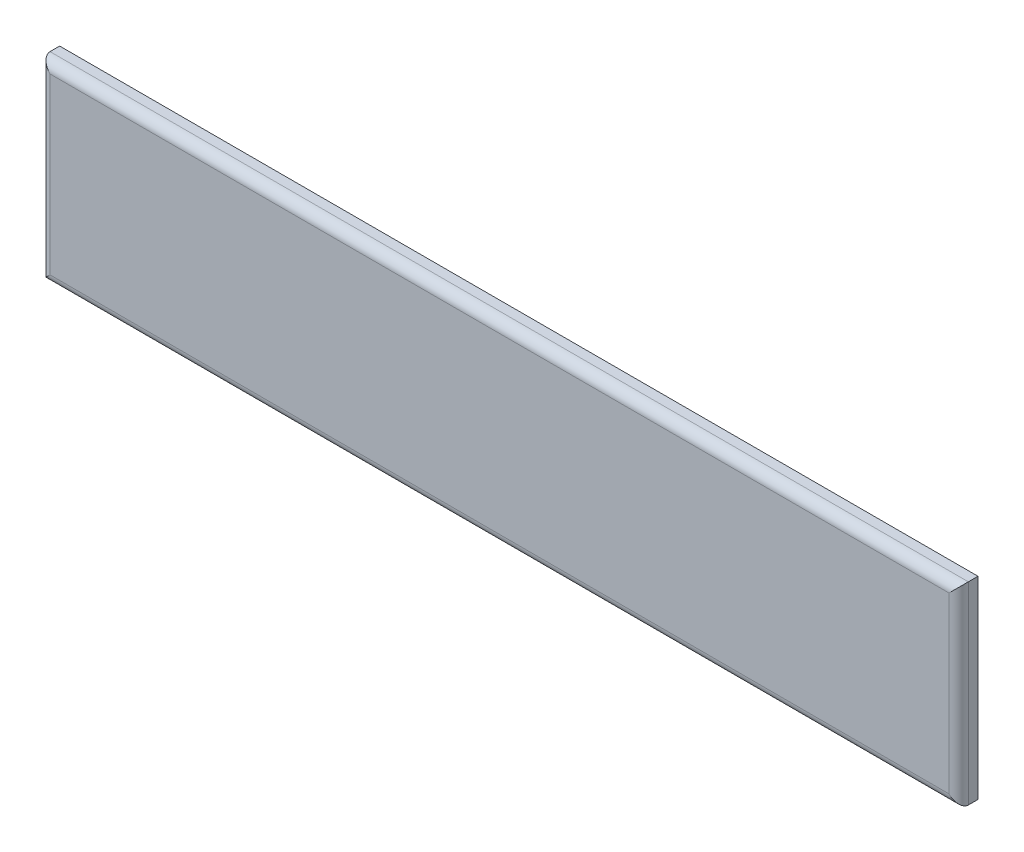
ISO-10303-21;
HEADER;
FILE_DESCRIPTION(('STEP AP214'),'2;1');
FILE_NAME('part.step','',(''),(''),'','','');
FILE_SCHEMA(('AUTOMOTIVE_DESIGN { 1 0 10303 214 1 1 1 1 }'));
ENDSEC;
DATA;
#1=APPLICATION_CONTEXT('core data for automotive mechanical design processes');
#2=APPLICATION_PROTOCOL_DEFINITION('international standard','automotive_design',2000,#1);
#3=PRODUCT_CONTEXT('',#1,'mechanical');
#4=PRODUCT('Part','Part','',(#3));
#5=PRODUCT_RELATED_PRODUCT_CATEGORY('part','',(#4));
#6=PRODUCT_DEFINITION_FORMATION('','',#4);
#7=PRODUCT_DEFINITION_CONTEXT('part definition',#1,'design');
#8=PRODUCT_DEFINITION('design','',#6,#7);
#9=PRODUCT_DEFINITION_SHAPE('','',#8);
#10=(LENGTH_UNIT() NAMED_UNIT(*) SI_UNIT(.MILLI.,.METRE.));
#11=(NAMED_UNIT(*) PLANE_ANGLE_UNIT() SI_UNIT($,.RADIAN.));
#12=(NAMED_UNIT(*) SI_UNIT($,.STERADIAN.) SOLID_ANGLE_UNIT());
#13=UNCERTAINTY_MEASURE_WITH_UNIT(LENGTH_MEASURE(1.E-05),#10,'distance_accuracy_value','');
#14=(GEOMETRIC_REPRESENTATION_CONTEXT(3) GLOBAL_UNCERTAINTY_ASSIGNED_CONTEXT((#13)) GLOBAL_UNIT_ASSIGNED_CONTEXT((#10,
#11,#12)) REPRESENTATION_CONTEXT('',''));
#15=CARTESIAN_POINT('',(0.,0.,0.));
#16=DIRECTION('',(0.,0.,1.));
#17=DIRECTION('',(1.,0.,0.));
#18=AXIS2_PLACEMENT_3D('',#15,#16,#17);
#19=CARTESIAN_POINT('',(-47.5,-10.,1.));
#20=DIRECTION('',(1.,0.,0.));
#21=DIRECTION('',(0.,0.,-1.));
#22=AXIS2_PLACEMENT_3D('',#19,#20,#21);
#23=PLANE('',#22);
#24=DIRECTION('',(0.,0.,-1.));
#25=VECTOR('',#24,1.);
#26=CARTESIAN_POINT('',(-47.5,-10.,1.));
#27=LINE('',#26,#25);
#28=CARTESIAN_POINT('',(-47.5,-10.,0.));
#29=VERTEX_POINT('',#28);
#30=CARTESIAN_POINT('',(-47.5,-10.,-1.));
#31=VERTEX_POINT('',#30);
#32=EDGE_CURVE('E264',#29,#31,#27,.T.);
#33=ORIENTED_EDGE('',*,*,#32,.F.);
#34=DIRECTION('',(0.,-1.,0.));
#35=VECTOR('',#34,1.);
#36=CARTESIAN_POINT('',(-47.5,9.99999999999999,0.));
#37=LINE('',#36,#35);
#38=CARTESIAN_POINT('',(-47.5,9.99999999999999,0.));
#39=VERTEX_POINT('',#38);
#40=EDGE_CURVE('E280',#29,#39,#37,.F.);
#41=ORIENTED_EDGE('',*,*,#40,.T.);
#42=DIRECTION('',(0.,0.,-1.));
#43=VECTOR('',#42,1.);
#44=CARTESIAN_POINT('',(-47.5,9.99999999999999,1.));
#45=LINE('',#44,#43);
#46=CARTESIAN_POINT('',(-47.5,9.99999999999999,-1.));
#47=VERTEX_POINT('',#46);
#48=EDGE_CURVE('E255',#39,#47,#45,.T.);
#49=ORIENTED_EDGE('',*,*,#48,.T.);
#50=DIRECTION('',(0.,-1.,0.));
#51=VECTOR('',#50,1.);
#52=CARTESIAN_POINT('',(-47.5,-10.,-1.));
#53=LINE('',#52,#51);
#54=EDGE_CURVE('E239',#47,#31,#53,.T.);
#55=ORIENTED_EDGE('',*,*,#54,.T.);
#56=EDGE_LOOP('',(#33,#41,#49,#55));
#57=FACE_BOUND('',#56,.T.);
#58=ADVANCED_FACE('F45',(#57),#23,.F.);
#59=CARTESIAN_POINT('',(47.5,-10.,1.));
#60=DIRECTION('',(0.,1.,0.));
#61=DIRECTION('',(-1.,0.,0.));
#62=AXIS2_PLACEMENT_3D('',#59,#60,#61);
#63=PLANE('',#62);
#64=DIRECTION('',(0.,0.,-1.));
#65=VECTOR('',#64,1.);
#66=CARTESIAN_POINT('',(47.5,-10.,1.));
#67=LINE('',#66,#65);
#68=CARTESIAN_POINT('',(47.5,-10.,0.));
#69=VERTEX_POINT('',#68);
#70=CARTESIAN_POINT('',(47.5,-10.,-1.));
#71=VERTEX_POINT('',#70);
#72=EDGE_CURVE('E261',#69,#71,#67,.T.);
#73=ORIENTED_EDGE('',*,*,#72,.F.);
#74=DIRECTION('',(1.,0.,0.));
#75=VECTOR('',#74,1.);
#76=CARTESIAN_POINT('',(-47.5,-10.,0.));
#77=LINE('',#76,#75);
#78=EDGE_CURVE('E284',#69,#29,#77,.F.);
#79=ORIENTED_EDGE('',*,*,#78,.T.);
#80=ORIENTED_EDGE('',*,*,#32,.T.);
#81=DIRECTION('',(1.,0.,0.));
#82=VECTOR('',#81,1.);
#83=CARTESIAN_POINT('',(47.5,-10.,-1.));
#84=LINE('',#83,#82);
#85=EDGE_CURVE('E243',#31,#71,#84,.T.);
#86=ORIENTED_EDGE('',*,*,#85,.T.);
#87=EDGE_LOOP('',(#73,#79,#80,#86));
#88=FACE_BOUND('',#87,.T.);
#89=ADVANCED_FACE('F313',(#88),#63,.F.);
#90=CARTESIAN_POINT('',(47.5,-10.,1.));
#91=DIRECTION('',(-1.,0.,0.));
#92=DIRECTION('',(0.,0.,1.));
#93=AXIS2_PLACEMENT_3D('',#90,#91,#92);
#94=PLANE('',#93);
#95=DIRECTION('',(0.,0.,-1.));
#96=VECTOR('',#95,1.);
#97=CARTESIAN_POINT('',(47.5,10.,1.));
#98=LINE('',#97,#96);
#99=CARTESIAN_POINT('',(47.5,10.,0.));
#100=VERTEX_POINT('',#99);
#101=CARTESIAN_POINT('',(47.5,10.,-1.));
#102=VERTEX_POINT('',#101);
#103=EDGE_CURVE('E258',#100,#102,#98,.T.);
#104=ORIENTED_EDGE('',*,*,#103,.F.);
#105=DIRECTION('',(0.,1.,0.));
#106=VECTOR('',#105,1.);
#107=CARTESIAN_POINT('',(47.5,-10.,0.));
#108=LINE('',#107,#106);
#109=EDGE_CURVE('E55',#100,#69,#108,.F.);
#110=ORIENTED_EDGE('',*,*,#109,.T.);
#111=ORIENTED_EDGE('',*,*,#72,.T.);
#112=DIRECTION('',(0.,1.,0.));
#113=VECTOR('',#112,1.);
#114=CARTESIAN_POINT('',(47.5,-10.,-1.));
#115=LINE('',#114,#113);
#116=EDGE_CURVE('E247',#71,#102,#115,.T.);
#117=ORIENTED_EDGE('',*,*,#116,.T.);
#118=EDGE_LOOP('',(#104,#110,#111,#117));
#119=FACE_BOUND('',#118,.T.);
#120=ADVANCED_FACE('F334',(#119),#94,.F.);
#121=CARTESIAN_POINT('',(47.5,10.,1.));
#122=DIRECTION('',(0.,-1.,0.));
#123=DIRECTION('',(1.,0.,0.));
#124=AXIS2_PLACEMENT_3D('',#121,#122,#123);
#125=PLANE('',#124);
#126=ORIENTED_EDGE('',*,*,#48,.F.);
#127=DIRECTION('',(-1.,0.,0.));
#128=VECTOR('',#127,1.);
#129=CARTESIAN_POINT('',(47.5,10.,0.));
#130=LINE('',#129,#128);
#131=EDGE_CURVE('E11',#39,#100,#130,.F.);
#132=ORIENTED_EDGE('',*,*,#131,.T.);
#133=ORIENTED_EDGE('',*,*,#103,.T.);
#134=DIRECTION('',(-1.,0.,0.));
#135=VECTOR('',#134,1.);
#136=CARTESIAN_POINT('',(47.5,10.,-1.));
#137=LINE('',#136,#135);
#138=EDGE_CURVE('E251',#102,#47,#137,.T.);
#139=ORIENTED_EDGE('',*,*,#138,.T.);
#140=EDGE_LOOP('',(#126,#132,#133,#139));
#141=FACE_BOUND('',#140,.T.);
#142=ADVANCED_FACE('F325',(#141),#125,.F.);
#143=CARTESIAN_POINT('',(0.,0.,1.));
#144=DIRECTION('',(0.,0.,1.));
#145=DIRECTION('',(1.,0.,0.));
#146=AXIS2_PLACEMENT_3D('',#143,#144,#145);
#147=PLANE('',#146);
#148=DIRECTION('',(-1.,0.,0.));
#149=VECTOR('',#148,1.);
#150=CARTESIAN_POINT('',(-47.5,8.99999999999999,1.));
#151=LINE('',#150,#149);
#152=CARTESIAN_POINT('',(46.5,9.00000000000001,1.));
#153=VERTEX_POINT('',#152);
#154=CARTESIAN_POINT('',(-46.5,8.99999999999999,1.));
#155=VERTEX_POINT('',#154);
#156=EDGE_CURVE('E267',#153,#155,#151,.T.);
#157=ORIENTED_EDGE('',*,*,#156,.T.);
#158=DIRECTION('',(0.,-1.,0.));
#159=VECTOR('',#158,1.);
#160=CARTESIAN_POINT('',(-46.5,-10.,1.));
#161=LINE('',#160,#159);
#162=CARTESIAN_POINT('',(-46.5,-9.00000000000001,1.));
#163=VERTEX_POINT('',#162);
#164=EDGE_CURVE('E276',#155,#163,#161,.T.);
#165=ORIENTED_EDGE('',*,*,#164,.T.);
#166=DIRECTION('',(1.,0.,0.));
#167=VECTOR('',#166,1.);
#168=CARTESIAN_POINT('',(47.5,-9.,1.));
#169=LINE('',#168,#167);
#170=CARTESIAN_POINT('',(46.5,-9.,1.));
#171=VERTEX_POINT('',#170);
#172=EDGE_CURVE('E273',#163,#171,#169,.T.);
#173=ORIENTED_EDGE('',*,*,#172,.T.);
#174=DIRECTION('',(0.,1.,0.));
#175=VECTOR('',#174,1.);
#176=CARTESIAN_POINT('',(46.5,10.,1.));
#177=LINE('',#176,#175);
#178=EDGE_CURVE('E270',#171,#153,#177,.T.);
#179=ORIENTED_EDGE('',*,*,#178,.T.);
#180=EDGE_LOOP('',(#157,#165,#173,#179));
#181=FACE_BOUND('',#180,.T.);
#182=ADVANCED_FACE('F322',(#181),#147,.T.);
#183=CARTESIAN_POINT('',(0.,0.,-1.));
#184=DIRECTION('',(0.,0.,1.));
#185=DIRECTION('',(1.,0.,0.));
#186=AXIS2_PLACEMENT_3D('',#183,#184,#185);
#187=PLANE('',#186);
#188=CARTESIAN_POINT('',(-46.8,0.,-1.));
#189=DIRECTION('',(0.,0.,-1.));
#190=DIRECTION('',(-1.,0.,0.));
#191=AXIS2_PLACEMENT_3D('',#188,#189,#190);
#192=CIRCLE('',#191,0.249999999999993);
#193=CARTESIAN_POINT('',(-47.05,0.,-1.));
#194=VERTEX_POINT('',#193);
#195=EDGE_CURVE('E145',#194,#194,#192,.T.);
#196=ORIENTED_EDGE('',*,*,#195,.F.);
#197=EDGE_LOOP('',(#196));
#198=FACE_BOUND('',#197,.T.);
#199=CARTESIAN_POINT('',(-43.4,0.,-1.));
#200=DIRECTION('',(0.,0.,-1.));
#201=DIRECTION('',(-1.,0.,0.));
#202=AXIS2_PLACEMENT_3D('',#199,#200,#201);
#203=CIRCLE('',#202,0.249999999999993);
#204=CARTESIAN_POINT('',(-43.65,0.,-1.));
#205=VERTEX_POINT('',#204);
#206=EDGE_CURVE('E144',#205,#205,#203,.T.);
#207=ORIENTED_EDGE('',*,*,#206,.F.);
#208=EDGE_LOOP('',(#207));
#209=FACE_BOUND('',#208,.T.);
#210=CARTESIAN_POINT('',(46.8,0.,-1.));
#211=DIRECTION('',(0.,0.,-1.));
#212=DIRECTION('',(-1.,0.,0.));
#213=AXIS2_PLACEMENT_3D('',#210,#211,#212);
#214=CIRCLE('',#213,0.249999999999993);
#215=CARTESIAN_POINT('',(46.55,0.,-1.));
#216=VERTEX_POINT('',#215);
#217=EDGE_CURVE('E158',#216,#216,#214,.T.);
#218=ORIENTED_EDGE('',*,*,#217,.F.);
#219=EDGE_LOOP('',(#218));
#220=FACE_BOUND('',#219,.T.);
#221=CARTESIAN_POINT('',(43.4,0.,-1.));
#222=DIRECTION('',(0.,0.,-1.));
#223=DIRECTION('',(-1.,0.,0.));
#224=AXIS2_PLACEMENT_3D('',#221,#222,#223);
#225=CIRCLE('',#224,0.249999999999993);
#226=CARTESIAN_POINT('',(43.15,0.,-1.));
#227=VERTEX_POINT('',#226);
#228=EDGE_CURVE('E166',#227,#227,#225,.T.);
#229=ORIENTED_EDGE('',*,*,#228,.F.);
#230=EDGE_LOOP('',(#229));
#231=FACE_BOUND('',#230,.T.);
#232=CARTESIAN_POINT('',(44.,8.00000000000001,-1.));
#233=DIRECTION('',(0.,0.,-1.));
#234=DIRECTION('',(-1.,0.,0.));
#235=AXIS2_PLACEMENT_3D('',#232,#233,#234);
#236=CIRCLE('',#235,0.249999999999986);
#237=CARTESIAN_POINT('',(43.75,8.00000000000001,-1.));
#238=VERTEX_POINT('',#237);
#239=EDGE_CURVE('E174',#238,#238,#236,.T.);
#240=ORIENTED_EDGE('',*,*,#239,.F.);
#241=EDGE_LOOP('',(#240));
#242=FACE_BOUND('',#241,.T.);
#243=CARTESIAN_POINT('',(40.,8.00000000000004,-1.));
#244=DIRECTION('',(0.,0.,-1.));
#245=DIRECTION('',(-1.,0.,0.));
#246=AXIS2_PLACEMENT_3D('',#243,#244,#245);
#247=CIRCLE('',#246,0.249999999999986);
#248=CARTESIAN_POINT('',(39.75,8.00000000000004,-1.));
#249=VERTEX_POINT('',#248);
#250=EDGE_CURVE('E182',#249,#249,#247,.T.);
#251=ORIENTED_EDGE('',*,*,#250,.F.);
#252=EDGE_LOOP('',(#251));
#253=FACE_BOUND('',#252,.T.);
#254=CARTESIAN_POINT('',(-40.,8.00000000000001,-1.));
#255=DIRECTION('',(0.,0.,-1.));
#256=DIRECTION('',(-1.,0.,0.));
#257=AXIS2_PLACEMENT_3D('',#254,#255,#256);
#258=CIRCLE('',#257,0.249999999999986);
#259=CARTESIAN_POINT('',(-40.25,8.00000000000001,-1.));
#260=VERTEX_POINT('',#259);
#261=EDGE_CURVE('E190',#260,#260,#258,.T.);
#262=ORIENTED_EDGE('',*,*,#261,.F.);
#263=EDGE_LOOP('',(#262));
#264=FACE_BOUND('',#263,.T.);
#265=CARTESIAN_POINT('',(-44.,8.00000000000001,-1.));
#266=DIRECTION('',(0.,0.,-1.));
#267=DIRECTION('',(-1.,0.,0.));
#268=AXIS2_PLACEMENT_3D('',#265,#266,#267);
#269=CIRCLE('',#268,0.249999999999986);
#270=CARTESIAN_POINT('',(-44.25,8.00000000000001,-1.));
#271=VERTEX_POINT('',#270);
#272=EDGE_CURVE('E198',#271,#271,#269,.T.);
#273=ORIENTED_EDGE('',*,*,#272,.F.);
#274=EDGE_LOOP('',(#273));
#275=FACE_BOUND('',#274,.T.);
#276=CARTESIAN_POINT('',(44.,-8.00000000000001,-1.));
#277=DIRECTION('',(0.,0.,-1.));
#278=DIRECTION('',(-1.,0.,0.));
#279=AXIS2_PLACEMENT_3D('',#276,#277,#278);
#280=CIRCLE('',#279,0.249999999999986);
#281=CARTESIAN_POINT('',(43.75,-8.00000000000001,-1.));
#282=VERTEX_POINT('',#281);
#283=EDGE_CURVE('E206',#282,#282,#280,.T.);
#284=ORIENTED_EDGE('',*,*,#283,.F.);
#285=EDGE_LOOP('',(#284));
#286=FACE_BOUND('',#285,.T.);
#287=CARTESIAN_POINT('',(40.,-8.00000000000004,-1.));
#288=DIRECTION('',(0.,0.,-1.));
#289=DIRECTION('',(-1.,0.,0.));
#290=AXIS2_PLACEMENT_3D('',#287,#288,#289);
#291=CIRCLE('',#290,0.249999999999986);
#292=CARTESIAN_POINT('',(39.75,-8.00000000000004,-1.));
#293=VERTEX_POINT('',#292);
#294=EDGE_CURVE('E214',#293,#293,#291,.T.);
#295=ORIENTED_EDGE('',*,*,#294,.F.);
#296=EDGE_LOOP('',(#295));
#297=FACE_BOUND('',#296,.T.);
#298=CARTESIAN_POINT('',(-40.,-8.00000000000001,-1.));
#299=DIRECTION('',(0.,0.,-1.));
#300=DIRECTION('',(-1.,0.,0.));
#301=AXIS2_PLACEMENT_3D('',#298,#299,#300);
#302=CIRCLE('',#301,0.249999999999986);
#303=CARTESIAN_POINT('',(-40.25,-8.00000000000001,-1.));
#304=VERTEX_POINT('',#303);
#305=EDGE_CURVE('E222',#304,#304,#302,.T.);
#306=ORIENTED_EDGE('',*,*,#305,.F.);
#307=EDGE_LOOP('',(#306));
#308=FACE_BOUND('',#307,.T.);
#309=CARTESIAN_POINT('',(-44.,-8.00000000000001,-1.));
#310=DIRECTION('',(0.,0.,-1.));
#311=DIRECTION('',(-1.,0.,0.));
#312=AXIS2_PLACEMENT_3D('',#309,#310,#311);
#313=CIRCLE('',#312,0.249999999999986);
#314=CARTESIAN_POINT('',(-44.25,-8.00000000000001,-1.));
#315=VERTEX_POINT('',#314);
#316=EDGE_CURVE('E230',#315,#315,#313,.T.);
#317=ORIENTED_EDGE('',*,*,#316,.F.);
#318=EDGE_LOOP('',(#317));
#319=FACE_BOUND('',#318,.T.);
#320=ORIENTED_EDGE('',*,*,#54,.F.);
#321=ORIENTED_EDGE('',*,*,#138,.F.);
#322=ORIENTED_EDGE('',*,*,#116,.F.);
#323=ORIENTED_EDGE('',*,*,#85,.F.);
#324=EDGE_LOOP('',(#320,#321,#322,#323));
#325=FACE_BOUND('',#324,.T.);
#326=ADVANCED_FACE('F324',(#198,#209,#220,#231,#242,#253,#264,#275,#286,#297,#308,#319,#325),
#187,.F.);
#327=CARTESIAN_POINT('',(46.5,0.,0.));
#328=DIRECTION('',(0.,-1.,0.));
#329=DIRECTION('',(0.,0.,-1.));
#330=AXIS2_PLACEMENT_3D('',#327,#328,#329);
#331=CYLINDRICAL_SURFACE('',#330,1.);
#332=CARTESIAN_POINT('',(46.5,-9.,0.));
#333=DIRECTION('',(-0.707106781186547,-0.707106781186548,0.));
#334=DIRECTION('',(0.707106781186548,-0.707106781186547,0.));
#335=AXIS2_PLACEMENT_3D('',#332,#333,#334);
#336=ELLIPSE('',#335,1.41421356237309,1.);
#337=EDGE_CURVE('E293',#69,#171,#336,.T.);
#338=ORIENTED_EDGE('',*,*,#337,.F.);
#339=ORIENTED_EDGE('',*,*,#109,.F.);
#340=CARTESIAN_POINT('',(46.5,9.00000000000001,0.));
#341=DIRECTION('',(0.707106781186548,-0.707106781186547,0.));
#342=DIRECTION('',(0.707106781186547,0.707106781186548,0.));
#343=AXIS2_PLACEMENT_3D('',#340,#341,#342);
#344=ELLIPSE('',#343,1.4142135623731,1.);
#345=EDGE_CURVE('E49',#153,#100,#344,.F.);
#346=ORIENTED_EDGE('',*,*,#345,.F.);
#347=ORIENTED_EDGE('',*,*,#178,.F.);
#348=EDGE_LOOP('',(#338,#339,#346,#347));
#349=FACE_BOUND('',#348,.T.);
#350=ADVANCED_FACE('F47',(#349),#331,.T.);
#351=CARTESIAN_POINT('',(0.,9.,0.));
#352=DIRECTION('',(1.,0.,0.));
#353=DIRECTION('',(0.,1.,0.));
#354=AXIS2_PLACEMENT_3D('',#351,#352,#353);
#355=CYLINDRICAL_SURFACE('',#354,1.);
#356=ORIENTED_EDGE('',*,*,#345,.T.);
#357=ORIENTED_EDGE('',*,*,#131,.F.);
#358=CARTESIAN_POINT('',(-46.5,8.99999999999999,0.));
#359=DIRECTION('',(0.707106781186547,0.707106781186548,0.));
#360=DIRECTION('',(0.707106781186548,-0.707106781186547,0.));
#361=AXIS2_PLACEMENT_3D('',#358,#359,#360);
#362=ELLIPSE('',#361,1.41421356237309,1.);
#363=EDGE_CURVE('E291',#155,#39,#362,.F.);
#364=ORIENTED_EDGE('',*,*,#363,.F.);
#365=ORIENTED_EDGE('',*,*,#156,.F.);
#366=EDGE_LOOP('',(#356,#357,#364,#365));
#367=FACE_BOUND('',#366,.T.);
#368=ADVANCED_FACE('F305',(#367),#355,.T.);
#369=CARTESIAN_POINT('',(0.,-9.00000000000001,0.));
#370=DIRECTION('',(-1.,0.,0.));
#371=DIRECTION('',(0.,-1.,0.));
#372=AXIS2_PLACEMENT_3D('',#369,#370,#371);
#373=CYLINDRICAL_SURFACE('',#372,1.);
#374=ORIENTED_EDGE('',*,*,#337,.T.);
#375=ORIENTED_EDGE('',*,*,#172,.F.);
#376=CARTESIAN_POINT('',(-46.5,-9.00000000000001,0.));
#377=DIRECTION('',(-0.707106781186548,0.707106781186547,0.));
#378=DIRECTION('',(-0.707106781186547,-0.707106781186548,0.));
#379=AXIS2_PLACEMENT_3D('',#376,#377,#378);
#380=ELLIPSE('',#379,1.4142135623731,1.);
#381=EDGE_CURVE('E238',#29,#163,#380,.T.);
#382=ORIENTED_EDGE('',*,*,#381,.F.);
#383=ORIENTED_EDGE('',*,*,#78,.F.);
#384=EDGE_LOOP('',(#374,#375,#382,#383));
#385=FACE_BOUND('',#384,.T.);
#386=ADVANCED_FACE('F310',(#385),#373,.T.);
#387=CARTESIAN_POINT('',(-46.5,0.,0.));
#388=DIRECTION('',(0.,1.,0.));
#389=DIRECTION('',(0.,0.,1.));
#390=AXIS2_PLACEMENT_3D('',#387,#388,#389);
#391=CYLINDRICAL_SURFACE('',#390,1.);
#392=ORIENTED_EDGE('',*,*,#363,.T.);
#393=ORIENTED_EDGE('',*,*,#40,.F.);
#394=ORIENTED_EDGE('',*,*,#381,.T.);
#395=ORIENTED_EDGE('',*,*,#164,.F.);
#396=EDGE_LOOP('',(#392,#393,#394,#395));
#397=FACE_BOUND('',#396,.T.);
#398=ADVANCED_FACE('F319',(#397),#391,.T.);
#399=CARTESIAN_POINT('',(-44.,-8.00000000000001,0.));
#400=DIRECTION('',(0.,0.,-1.));
#401=DIRECTION('',(-1.,0.,0.));
#402=AXIS2_PLACEMENT_3D('',#399,#400,#401);
#403=CONICAL_SURFACE('',#402,0.249999999999986,1.02974425867665);
#404=CARTESIAN_POINT('',(-44.,-8.00000000000001,0.150215154756884));
#405=VERTEX_POINT('',#404);
#406=VERTEX_LOOP('',#405);
#407=FACE_BOUND('',#406,.T.);
#408=CARTESIAN_POINT('',(-44.,-8.00000000000001,0.));
#409=DIRECTION('',(0.,0.,-1.));
#410=DIRECTION('',(-1.,0.,0.));
#411=AXIS2_PLACEMENT_3D('',#408,#409,#410);
#412=CIRCLE('',#411,0.249999999999986);
#413=CARTESIAN_POINT('',(-44.25,-8.00000000000001,0.));
#414=VERTEX_POINT('',#413);
#415=EDGE_CURVE('E234',#414,#414,#412,.T.);
#416=ORIENTED_EDGE('',*,*,#415,.T.);
#417=EDGE_LOOP('',(#416));
#418=FACE_BOUND('',#417,.T.);
#419=ADVANCED_FACE('F347',(#407,#418),#403,.F.);
#420=CARTESIAN_POINT('',(-44.,-8.00000000000001,-1.));
#421=DIRECTION('',(0.,0.,-1.));
#422=DIRECTION('',(-1.,0.,0.));
#423=AXIS2_PLACEMENT_3D('',#420,#421,#422);
#424=CYLINDRICAL_SURFACE('',#423,0.249999999999986);
#425=ORIENTED_EDGE('',*,*,#415,.F.);
#426=EDGE_LOOP('',(#425));
#427=FACE_BOUND('',#426,.T.);
#428=ORIENTED_EDGE('',*,*,#316,.T.);
#429=EDGE_LOOP('',(#428));
#430=FACE_BOUND('',#429,.T.);
#431=ADVANCED_FACE('F384',(#427,#430),#424,.F.);
#432=CARTESIAN_POINT('',(-40.,-8.00000000000001,0.));
#433=DIRECTION('',(0.,0.,-1.));
#434=DIRECTION('',(-1.,0.,0.));
#435=AXIS2_PLACEMENT_3D('',#432,#433,#434);
#436=CONICAL_SURFACE('',#435,0.249999999999986,1.02974425867665);
#437=CARTESIAN_POINT('',(-40.,-8.00000000000001,0.150215154756884));
#438=VERTEX_POINT('',#437);
#439=VERTEX_LOOP('',#438);
#440=FACE_BOUND('',#439,.T.);
#441=CARTESIAN_POINT('',(-40.,-8.00000000000001,0.));
#442=DIRECTION('',(0.,0.,-1.));
#443=DIRECTION('',(-1.,0.,0.));
#444=AXIS2_PLACEMENT_3D('',#441,#442,#443);
#445=CIRCLE('',#444,0.249999999999986);
#446=CARTESIAN_POINT('',(-40.25,-8.00000000000001,0.));
#447=VERTEX_POINT('',#446);
#448=EDGE_CURVE('E226',#447,#447,#445,.T.);
#449=ORIENTED_EDGE('',*,*,#448,.T.);
#450=EDGE_LOOP('',(#449));
#451=FACE_BOUND('',#450,.T.);
#452=ADVANCED_FACE('F393',(#440,#451),#436,.F.);
#453=CARTESIAN_POINT('',(-40.,-8.00000000000001,-1.));
#454=DIRECTION('',(0.,0.,-1.));
#455=DIRECTION('',(-1.,0.,0.));
#456=AXIS2_PLACEMENT_3D('',#453,#454,#455);
#457=CYLINDRICAL_SURFACE('',#456,0.249999999999986);
#458=ORIENTED_EDGE('',*,*,#448,.F.);
#459=EDGE_LOOP('',(#458));
#460=FACE_BOUND('',#459,.T.);
#461=ORIENTED_EDGE('',*,*,#305,.T.);
#462=EDGE_LOOP('',(#461));
#463=FACE_BOUND('',#462,.T.);
#464=ADVANCED_FACE('F403',(#460,#463),#457,.F.);
#465=CARTESIAN_POINT('',(40.,-8.00000000000004,0.));
#466=DIRECTION('',(0.,0.,-1.));
#467=DIRECTION('',(-1.,0.,0.));
#468=AXIS2_PLACEMENT_3D('',#465,#466,#467);
#469=CONICAL_SURFACE('',#468,0.249999999999986,1.02974425867665);
#470=CARTESIAN_POINT('',(40.,-8.00000000000004,0.150215154756884));
#471=VERTEX_POINT('',#470);
#472=VERTEX_LOOP('',#471);
#473=FACE_BOUND('',#472,.T.);
#474=CARTESIAN_POINT('',(40.,-8.00000000000004,0.));
#475=DIRECTION('',(0.,0.,-1.));
#476=DIRECTION('',(-1.,0.,0.));
#477=AXIS2_PLACEMENT_3D('',#474,#475,#476);
#478=CIRCLE('',#477,0.249999999999986);
#479=CARTESIAN_POINT('',(39.75,-8.00000000000004,0.));
#480=VERTEX_POINT('',#479);
#481=EDGE_CURVE('E218',#480,#480,#478,.T.);
#482=ORIENTED_EDGE('',*,*,#481,.T.);
#483=EDGE_LOOP('',(#482));
#484=FACE_BOUND('',#483,.T.);
#485=ADVANCED_FACE('F413',(#473,#484),#469,.F.);
#486=CARTESIAN_POINT('',(40.,-8.00000000000004,-1.));
#487=DIRECTION('',(0.,0.,-1.));
#488=DIRECTION('',(-1.,0.,0.));
#489=AXIS2_PLACEMENT_3D('',#486,#487,#488);
#490=CYLINDRICAL_SURFACE('',#489,0.249999999999986);
#491=ORIENTED_EDGE('',*,*,#481,.F.);
#492=EDGE_LOOP('',(#491));
#493=FACE_BOUND('',#492,.T.);
#494=ORIENTED_EDGE('',*,*,#294,.T.);
#495=EDGE_LOOP('',(#494));
#496=FACE_BOUND('',#495,.T.);
#497=ADVANCED_FACE('F423',(#493,#496),#490,.F.);
#498=CARTESIAN_POINT('',(44.,-8.00000000000001,0.));
#499=DIRECTION('',(0.,0.,-1.));
#500=DIRECTION('',(-1.,0.,0.));
#501=AXIS2_PLACEMENT_3D('',#498,#499,#500);
#502=CONICAL_SURFACE('',#501,0.249999999999986,1.02974425867665);
#503=CARTESIAN_POINT('',(44.,-8.00000000000001,0.150215154756884));
#504=VERTEX_POINT('',#503);
#505=VERTEX_LOOP('',#504);
#506=FACE_BOUND('',#505,.T.);
#507=CARTESIAN_POINT('',(44.,-8.00000000000001,0.));
#508=DIRECTION('',(0.,0.,-1.));
#509=DIRECTION('',(-1.,0.,0.));
#510=AXIS2_PLACEMENT_3D('',#507,#508,#509);
#511=CIRCLE('',#510,0.249999999999986);
#512=CARTESIAN_POINT('',(43.75,-8.00000000000001,0.));
#513=VERTEX_POINT('',#512);
#514=EDGE_CURVE('E210',#513,#513,#511,.T.);
#515=ORIENTED_EDGE('',*,*,#514,.T.);
#516=EDGE_LOOP('',(#515));
#517=FACE_BOUND('',#516,.T.);
#518=ADVANCED_FACE('F433',(#506,#517),#502,.F.);
#519=CARTESIAN_POINT('',(44.,-8.00000000000001,-1.));
#520=DIRECTION('',(0.,0.,-1.));
#521=DIRECTION('',(-1.,0.,0.));
#522=AXIS2_PLACEMENT_3D('',#519,#520,#521);
#523=CYLINDRICAL_SURFACE('',#522,0.249999999999986);
#524=ORIENTED_EDGE('',*,*,#514,.F.);
#525=EDGE_LOOP('',(#524));
#526=FACE_BOUND('',#525,.T.);
#527=ORIENTED_EDGE('',*,*,#283,.T.);
#528=EDGE_LOOP('',(#527));
#529=FACE_BOUND('',#528,.T.);
#530=ADVANCED_FACE('F443',(#526,#529),#523,.F.);
#531=CARTESIAN_POINT('',(-44.,8.00000000000001,0.));
#532=DIRECTION('',(0.,0.,-1.));
#533=DIRECTION('',(-1.,0.,0.));
#534=AXIS2_PLACEMENT_3D('',#531,#532,#533);
#535=CONICAL_SURFACE('',#534,0.249999999999986,1.02974425867665);
#536=CARTESIAN_POINT('',(-44.,8.00000000000001,0.150215154756884));
#537=VERTEX_POINT('',#536);
#538=VERTEX_LOOP('',#537);
#539=FACE_BOUND('',#538,.T.);
#540=CARTESIAN_POINT('',(-44.,8.00000000000001,0.));
#541=DIRECTION('',(0.,0.,-1.));
#542=DIRECTION('',(-1.,0.,0.));
#543=AXIS2_PLACEMENT_3D('',#540,#541,#542);
#544=CIRCLE('',#543,0.249999999999986);
#545=CARTESIAN_POINT('',(-44.25,8.00000000000001,0.));
#546=VERTEX_POINT('',#545);
#547=EDGE_CURVE('E202',#546,#546,#544,.T.);
#548=ORIENTED_EDGE('',*,*,#547,.T.);
#549=EDGE_LOOP('',(#548));
#550=FACE_BOUND('',#549,.T.);
#551=ADVANCED_FACE('F453',(#539,#550),#535,.F.);
#552=CARTESIAN_POINT('',(-44.,8.00000000000001,-1.));
#553=DIRECTION('',(0.,0.,-1.));
#554=DIRECTION('',(-1.,0.,0.));
#555=AXIS2_PLACEMENT_3D('',#552,#553,#554);
#556=CYLINDRICAL_SURFACE('',#555,0.249999999999986);
#557=ORIENTED_EDGE('',*,*,#547,.F.);
#558=EDGE_LOOP('',(#557));
#559=FACE_BOUND('',#558,.T.);
#560=ORIENTED_EDGE('',*,*,#272,.T.);
#561=EDGE_LOOP('',(#560));
#562=FACE_BOUND('',#561,.T.);
#563=ADVANCED_FACE('F463',(#559,#562),#556,.F.);
#564=CARTESIAN_POINT('',(-40.,8.00000000000001,0.));
#565=DIRECTION('',(0.,0.,-1.));
#566=DIRECTION('',(-1.,0.,0.));
#567=AXIS2_PLACEMENT_3D('',#564,#565,#566);
#568=CONICAL_SURFACE('',#567,0.249999999999986,1.02974425867665);
#569=CARTESIAN_POINT('',(-40.,8.00000000000001,0.150215154756884));
#570=VERTEX_POINT('',#569);
#571=VERTEX_LOOP('',#570);
#572=FACE_BOUND('',#571,.T.);
#573=CARTESIAN_POINT('',(-40.,8.00000000000001,0.));
#574=DIRECTION('',(0.,0.,-1.));
#575=DIRECTION('',(-1.,0.,0.));
#576=AXIS2_PLACEMENT_3D('',#573,#574,#575);
#577=CIRCLE('',#576,0.249999999999986);
#578=CARTESIAN_POINT('',(-40.25,8.00000000000001,0.));
#579=VERTEX_POINT('',#578);
#580=EDGE_CURVE('E194',#579,#579,#577,.T.);
#581=ORIENTED_EDGE('',*,*,#580,.T.);
#582=EDGE_LOOP('',(#581));
#583=FACE_BOUND('',#582,.T.);
#584=ADVANCED_FACE('F473',(#572,#583),#568,.F.);
#585=CARTESIAN_POINT('',(-40.,8.00000000000001,-1.));
#586=DIRECTION('',(0.,0.,-1.));
#587=DIRECTION('',(-1.,0.,0.));
#588=AXIS2_PLACEMENT_3D('',#585,#586,#587);
#589=CYLINDRICAL_SURFACE('',#588,0.249999999999986);
#590=ORIENTED_EDGE('',*,*,#580,.F.);
#591=EDGE_LOOP('',(#590));
#592=FACE_BOUND('',#591,.T.);
#593=ORIENTED_EDGE('',*,*,#261,.T.);
#594=EDGE_LOOP('',(#593));
#595=FACE_BOUND('',#594,.T.);
#596=ADVANCED_FACE('F483',(#592,#595),#589,.F.);
#597=CARTESIAN_POINT('',(40.,8.00000000000004,0.));
#598=DIRECTION('',(0.,0.,-1.));
#599=DIRECTION('',(-1.,0.,0.));
#600=AXIS2_PLACEMENT_3D('',#597,#598,#599);
#601=CONICAL_SURFACE('',#600,0.249999999999986,1.02974425867665);
#602=CARTESIAN_POINT('',(40.,8.00000000000004,0.150215154756884));
#603=VERTEX_POINT('',#602);
#604=VERTEX_LOOP('',#603);
#605=FACE_BOUND('',#604,.T.);
#606=CARTESIAN_POINT('',(40.,8.00000000000004,0.));
#607=DIRECTION('',(0.,0.,-1.));
#608=DIRECTION('',(-1.,0.,0.));
#609=AXIS2_PLACEMENT_3D('',#606,#607,#608);
#610=CIRCLE('',#609,0.249999999999986);
#611=CARTESIAN_POINT('',(39.75,8.00000000000004,0.));
#612=VERTEX_POINT('',#611);
#613=EDGE_CURVE('E186',#612,#612,#610,.T.);
#614=ORIENTED_EDGE('',*,*,#613,.T.);
#615=EDGE_LOOP('',(#614));
#616=FACE_BOUND('',#615,.T.);
#617=ADVANCED_FACE('F493',(#605,#616),#601,.F.);
#618=CARTESIAN_POINT('',(40.,8.00000000000004,-1.));
#619=DIRECTION('',(0.,0.,-1.));
#620=DIRECTION('',(-1.,0.,0.));
#621=AXIS2_PLACEMENT_3D('',#618,#619,#620);
#622=CYLINDRICAL_SURFACE('',#621,0.249999999999986);
#623=ORIENTED_EDGE('',*,*,#613,.F.);
#624=EDGE_LOOP('',(#623));
#625=FACE_BOUND('',#624,.T.);
#626=ORIENTED_EDGE('',*,*,#250,.T.);
#627=EDGE_LOOP('',(#626));
#628=FACE_BOUND('',#627,.T.);
#629=ADVANCED_FACE('F503',(#625,#628),#622,.F.);
#630=CARTESIAN_POINT('',(44.,8.00000000000001,0.));
#631=DIRECTION('',(0.,0.,-1.));
#632=DIRECTION('',(-1.,0.,0.));
#633=AXIS2_PLACEMENT_3D('',#630,#631,#632);
#634=CONICAL_SURFACE('',#633,0.249999999999986,1.02974425867665);
#635=CARTESIAN_POINT('',(44.,8.00000000000001,0.150215154756884));
#636=VERTEX_POINT('',#635);
#637=VERTEX_LOOP('',#636);
#638=FACE_BOUND('',#637,.T.);
#639=CARTESIAN_POINT('',(44.,8.00000000000001,0.));
#640=DIRECTION('',(0.,0.,-1.));
#641=DIRECTION('',(-1.,0.,0.));
#642=AXIS2_PLACEMENT_3D('',#639,#640,#641);
#643=CIRCLE('',#642,0.249999999999986);
#644=CARTESIAN_POINT('',(43.75,8.00000000000001,0.));
#645=VERTEX_POINT('',#644);
#646=EDGE_CURVE('E178',#645,#645,#643,.T.);
#647=ORIENTED_EDGE('',*,*,#646,.T.);
#648=EDGE_LOOP('',(#647));
#649=FACE_BOUND('',#648,.T.);
#650=ADVANCED_FACE('F513',(#638,#649),#634,.F.);
#651=CARTESIAN_POINT('',(44.,8.00000000000001,-1.));
#652=DIRECTION('',(0.,0.,-1.));
#653=DIRECTION('',(-1.,0.,0.));
#654=AXIS2_PLACEMENT_3D('',#651,#652,#653);
#655=CYLINDRICAL_SURFACE('',#654,0.249999999999986);
#656=ORIENTED_EDGE('',*,*,#646,.F.);
#657=EDGE_LOOP('',(#656));
#658=FACE_BOUND('',#657,.T.);
#659=ORIENTED_EDGE('',*,*,#239,.T.);
#660=EDGE_LOOP('',(#659));
#661=FACE_BOUND('',#660,.T.);
#662=ADVANCED_FACE('F523',(#658,#661),#655,.F.);
#663=CARTESIAN_POINT('',(43.4,0.,0.));
#664=DIRECTION('',(0.,0.,-1.));
#665=DIRECTION('',(-1.,0.,0.));
#666=AXIS2_PLACEMENT_3D('',#663,#664,#665);
#667=CONICAL_SURFACE('',#666,0.249999999999986,1.02974425867665);
#668=CARTESIAN_POINT('',(43.4,0.,0.150215154756884));
#669=VERTEX_POINT('',#668);
#670=VERTEX_LOOP('',#669);
#671=FACE_BOUND('',#670,.T.);
#672=CARTESIAN_POINT('',(43.4,0.,0.));
#673=DIRECTION('',(0.,0.,-1.));
#674=DIRECTION('',(-1.,0.,0.));
#675=AXIS2_PLACEMENT_3D('',#672,#673,#674);
#676=CIRCLE('',#675,0.249999999999986);
#677=CARTESIAN_POINT('',(43.15,0.,0.));
#678=VERTEX_POINT('',#677);
#679=EDGE_CURVE('E170',#678,#678,#676,.T.);
#680=ORIENTED_EDGE('',*,*,#679,.T.);
#681=EDGE_LOOP('',(#680));
#682=FACE_BOUND('',#681,.T.);
#683=ADVANCED_FACE('F533',(#671,#682),#667,.F.);
#684=CARTESIAN_POINT('',(43.4,0.,-1.));
#685=DIRECTION('',(0.,0.,-1.));
#686=DIRECTION('',(-1.,0.,0.));
#687=AXIS2_PLACEMENT_3D('',#684,#685,#686);
#688=CYLINDRICAL_SURFACE('',#687,0.24999999999999);
#689=ORIENTED_EDGE('',*,*,#679,.F.);
#690=EDGE_LOOP('',(#689));
#691=FACE_BOUND('',#690,.T.);
#692=ORIENTED_EDGE('',*,*,#228,.T.);
#693=EDGE_LOOP('',(#692));
#694=FACE_BOUND('',#693,.T.);
#695=ADVANCED_FACE('F543',(#691,#694),#688,.F.);
#696=CARTESIAN_POINT('',(46.8,0.,0.));
#697=DIRECTION('',(0.,0.,-1.));
#698=DIRECTION('',(-1.,0.,0.));
#699=AXIS2_PLACEMENT_3D('',#696,#697,#698);
#700=CONICAL_SURFACE('',#699,0.249999999999986,1.02974425867665);
#701=CARTESIAN_POINT('',(46.8,0.,0.150215154756884));
#702=VERTEX_POINT('',#701);
#703=VERTEX_LOOP('',#702);
#704=FACE_BOUND('',#703,.T.);
#705=CARTESIAN_POINT('',(46.8,0.,0.));
#706=DIRECTION('',(0.,0.,-1.));
#707=DIRECTION('',(-1.,0.,0.));
#708=AXIS2_PLACEMENT_3D('',#705,#706,#707);
#709=CIRCLE('',#708,0.249999999999986);
#710=CARTESIAN_POINT('',(46.55,0.,0.));
#711=VERTEX_POINT('',#710);
#712=EDGE_CURVE('E162',#711,#711,#709,.T.);
#713=ORIENTED_EDGE('',*,*,#712,.T.);
#714=EDGE_LOOP('',(#713));
#715=FACE_BOUND('',#714,.T.);
#716=ADVANCED_FACE('F553',(#704,#715),#700,.F.);
#717=CARTESIAN_POINT('',(46.8,0.,-1.));
#718=DIRECTION('',(0.,0.,-1.));
#719=DIRECTION('',(-1.,0.,0.));
#720=AXIS2_PLACEMENT_3D('',#717,#718,#719);
#721=CYLINDRICAL_SURFACE('',#720,0.24999999999999);
#722=ORIENTED_EDGE('',*,*,#712,.F.);
#723=EDGE_LOOP('',(#722));
#724=FACE_BOUND('',#723,.T.);
#725=ORIENTED_EDGE('',*,*,#217,.T.);
#726=EDGE_LOOP('',(#725));
#727=FACE_BOUND('',#726,.T.);
#728=ADVANCED_FACE('F563',(#724,#727),#721,.F.);
#729=CARTESIAN_POINT('',(-43.4,0.,0.));
#730=DIRECTION('',(0.,0.,-1.));
#731=DIRECTION('',(-1.,0.,0.));
#732=AXIS2_PLACEMENT_3D('',#729,#730,#731);
#733=CONICAL_SURFACE('',#732,0.249999999999986,1.02974425867665);
#734=CARTESIAN_POINT('',(-43.4,0.,0.150215154756884));
#735=VERTEX_POINT('',#734);
#736=VERTEX_LOOP('',#735);
#737=FACE_BOUND('',#736,.T.);
#738=CARTESIAN_POINT('',(-43.4,0.,0.));
#739=DIRECTION('',(0.,0.,-1.));
#740=DIRECTION('',(-1.,0.,0.));
#741=AXIS2_PLACEMENT_3D('',#738,#739,#740);
#742=CIRCLE('',#741,0.249999999999986);
#743=CARTESIAN_POINT('',(-43.65,0.,0.));
#744=VERTEX_POINT('',#743);
#745=EDGE_CURVE('E150',#744,#744,#742,.T.);
#746=ORIENTED_EDGE('',*,*,#745,.T.);
#747=EDGE_LOOP('',(#746));
#748=FACE_BOUND('',#747,.T.);
#749=ADVANCED_FACE('F573',(#737,#748),#733,.F.);
#750=CARTESIAN_POINT('',(-43.4,0.,-1.));
#751=DIRECTION('',(0.,0.,-1.));
#752=DIRECTION('',(-1.,0.,0.));
#753=AXIS2_PLACEMENT_3D('',#750,#751,#752);
#754=CYLINDRICAL_SURFACE('',#753,0.24999999999999);
#755=ORIENTED_EDGE('',*,*,#745,.F.);
#756=EDGE_LOOP('',(#755));
#757=FACE_BOUND('',#756,.T.);
#758=ORIENTED_EDGE('',*,*,#206,.T.);
#759=EDGE_LOOP('',(#758));
#760=FACE_BOUND('',#759,.T.);
#761=ADVANCED_FACE('F137',(#757,#760),#754,.F.);
#762=CARTESIAN_POINT('',(-46.8,0.,0.));
#763=DIRECTION('',(0.,0.,-1.));
#764=DIRECTION('',(-1.,0.,0.));
#765=AXIS2_PLACEMENT_3D('',#762,#763,#764);
#766=CONICAL_SURFACE('',#765,0.249999999999986,1.02974425867665);
#767=CARTESIAN_POINT('',(-46.8,0.,0.150215154756884));
#768=VERTEX_POINT('',#767);
#769=VERTEX_LOOP('',#768);
#770=FACE_BOUND('',#769,.T.);
#771=CARTESIAN_POINT('',(-46.8,0.,0.));
#772=DIRECTION('',(0.,0.,-1.));
#773=DIRECTION('',(-1.,0.,0.));
#774=AXIS2_PLACEMENT_3D('',#771,#772,#773);
#775=CIRCLE('',#774,0.249999999999986);
#776=CARTESIAN_POINT('',(-47.05,0.,0.));
#777=VERTEX_POINT('',#776);
#778=EDGE_CURVE('E141',#777,#777,#775,.T.);
#779=ORIENTED_EDGE('',*,*,#778,.T.);
#780=EDGE_LOOP('',(#779));
#781=FACE_BOUND('',#780,.T.);
#782=ADVANCED_FACE('F133',(#770,#781),#766,.F.);
#783=CARTESIAN_POINT('',(-46.8,0.,-1.));
#784=DIRECTION('',(0.,0.,-1.));
#785=DIRECTION('',(-1.,0.,0.));
#786=AXIS2_PLACEMENT_3D('',#783,#784,#785);
#787=CYLINDRICAL_SURFACE('',#786,0.24999999999999);
#788=ORIENTED_EDGE('',*,*,#778,.F.);
#789=EDGE_LOOP('',(#788));
#790=FACE_BOUND('',#789,.T.);
#791=ORIENTED_EDGE('',*,*,#195,.T.);
#792=EDGE_LOOP('',(#791));
#793=FACE_BOUND('',#792,.T.);
#794=ADVANCED_FACE('F136',(#790,#793),#787,.F.);
#795=CLOSED_SHELL('',(#58,#89,#120,#142,#182,#326,#350,#368,#386,#398,#419,#431,#452,#464,#485,
#497,#518,#530,#551,#563,#584,#596,#617,#629,#650,#662,#683,#695,#716,#728,#749,#761,#782,#794));
#796=MANIFOLD_SOLID_BREP('B2',#795);
#797=ADVANCED_BREP_SHAPE_REPRESENTATION('',(#18,#796),#14);
#798=SHAPE_DEFINITION_REPRESENTATION(#9,#797);
ENDSEC;
END-ISO-10303-21;
